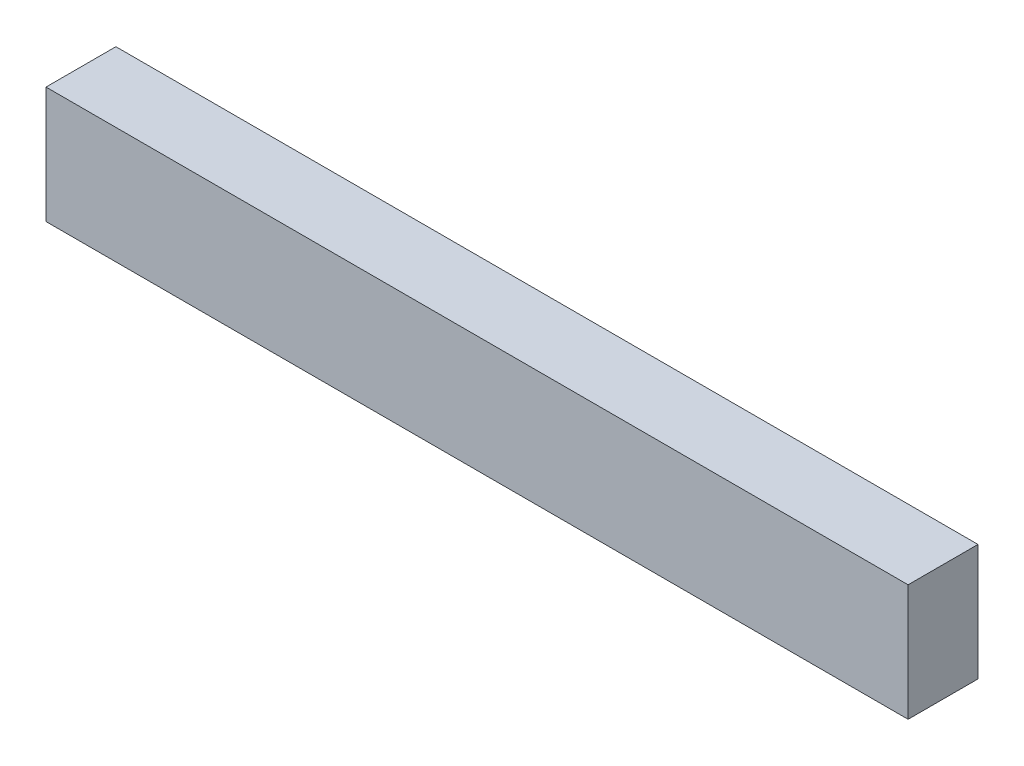
ISO-10303-21;
HEADER;
FILE_DESCRIPTION(('STEP AP214'),'2;1');
FILE_NAME('part.step','',(''),(''),'','','');
FILE_SCHEMA(('AUTOMOTIVE_DESIGN { 1 0 10303 214 1 1 1 1 }'));
ENDSEC;
DATA;
#1=APPLICATION_CONTEXT('core data for automotive mechanical design processes');
#2=APPLICATION_PROTOCOL_DEFINITION('international standard','automotive_design',2000,#1);
#3=PRODUCT_CONTEXT('',#1,'mechanical');
#4=PRODUCT('Part','Part','',(#3));
#5=PRODUCT_RELATED_PRODUCT_CATEGORY('part','',(#4));
#6=PRODUCT_DEFINITION_FORMATION('','',#4);
#7=PRODUCT_DEFINITION_CONTEXT('part definition',#1,'design');
#8=PRODUCT_DEFINITION('design','',#6,#7);
#9=PRODUCT_DEFINITION_SHAPE('','',#8);
#10=(LENGTH_UNIT() NAMED_UNIT(*) SI_UNIT(.MILLI.,.METRE.));
#11=(NAMED_UNIT(*) PLANE_ANGLE_UNIT() SI_UNIT($,.RADIAN.));
#12=(NAMED_UNIT(*) SI_UNIT($,.STERADIAN.) SOLID_ANGLE_UNIT());
#13=UNCERTAINTY_MEASURE_WITH_UNIT(LENGTH_MEASURE(1.E-05),#10,'distance_accuracy_value','');
#14=(GEOMETRIC_REPRESENTATION_CONTEXT(3) GLOBAL_UNCERTAINTY_ASSIGNED_CONTEXT((#13)) GLOBAL_UNIT_ASSIGNED_CONTEXT((#10,
#11,#12)) REPRESENTATION_CONTEXT('',''));
#15=CARTESIAN_POINT('',(0.,0.,0.));
#16=DIRECTION('',(0.,0.,1.));
#17=DIRECTION('',(1.,0.,0.));
#18=AXIS2_PLACEMENT_3D('',#15,#16,#17);
#19=CARTESIAN_POINT('',(117.475,31.75,9.525));
#20=DIRECTION('',(-1.,0.,0.));
#21=DIRECTION('',(0.,0.,1.));
#22=AXIS2_PLACEMENT_3D('',#19,#20,#21);
#23=PLANE('',#22);
#24=DIRECTION('',(0.,0.,-1.));
#25=VECTOR('',#24,1.);
#26=CARTESIAN_POINT('',(117.475,0.,9.525));
#27=LINE('',#26,#25);
#28=CARTESIAN_POINT('',(117.475,0.,9.525));
#29=VERTEX_POINT('',#28);
#30=CARTESIAN_POINT('',(117.475,0.,-9.525));
#31=VERTEX_POINT('',#30);
#32=EDGE_CURVE('E96',#29,#31,#27,.T.);
#33=ORIENTED_EDGE('',*,*,#32,.T.);
#34=DIRECTION('',(0.,-1.,0.));
#35=VECTOR('',#34,1.);
#36=CARTESIAN_POINT('',(117.475,31.75,-9.525));
#37=LINE('',#36,#35);
#38=CARTESIAN_POINT('',(117.475,31.75,-9.525));
#39=VERTEX_POINT('',#38);
#40=EDGE_CURVE('E11',#39,#31,#37,.T.);
#41=ORIENTED_EDGE('',*,*,#40,.F.);
#42=DIRECTION('',(0.,0.,-1.));
#43=VECTOR('',#42,1.);
#44=CARTESIAN_POINT('',(117.475,31.75,9.525));
#45=LINE('',#44,#43);
#46=CARTESIAN_POINT('',(117.475,31.75,9.525));
#47=VERTEX_POINT('',#46);
#48=EDGE_CURVE('E84',#47,#39,#45,.T.);
#49=ORIENTED_EDGE('',*,*,#48,.F.);
#50=DIRECTION('',(0.,-1.,0.));
#51=VECTOR('',#50,1.);
#52=CARTESIAN_POINT('',(117.475,31.75,9.525));
#53=LINE('',#52,#51);
#54=EDGE_CURVE('E92',#47,#29,#53,.T.);
#55=ORIENTED_EDGE('',*,*,#54,.T.);
#56=EDGE_LOOP('',(#33,#41,#49,#55));
#57=FACE_BOUND('',#56,.T.);
#58=ADVANCED_FACE('F33',(#57),#23,.F.);
#59=CARTESIAN_POINT('',(-117.475,31.75,-9.525));
#60=DIRECTION('',(0.,0.,1.));
#61=DIRECTION('',(1.,0.,0.));
#62=AXIS2_PLACEMENT_3D('',#59,#60,#61);
#63=PLANE('',#62);
#64=DIRECTION('',(-1.,0.,0.));
#65=VECTOR('',#64,1.);
#66=CARTESIAN_POINT('',(-117.475,0.,-9.525));
#67=LINE('',#66,#65);
#68=CARTESIAN_POINT('',(-117.475,0.,-9.525));
#69=VERTEX_POINT('',#68);
#70=EDGE_CURVE('E88',#31,#69,#67,.T.);
#71=ORIENTED_EDGE('',*,*,#70,.T.);
#72=DIRECTION('',(0.,-1.,0.));
#73=VECTOR('',#72,1.);
#74=CARTESIAN_POINT('',(-117.475,31.75,-9.525));
#75=LINE('',#74,#73);
#76=CARTESIAN_POINT('',(-117.475,31.75,-9.525));
#77=VERTEX_POINT('',#76);
#78=EDGE_CURVE('E41',#77,#69,#75,.T.);
#79=ORIENTED_EDGE('',*,*,#78,.F.);
#80=DIRECTION('',(-1.,0.,0.));
#81=VECTOR('',#80,1.);
#82=CARTESIAN_POINT('',(-117.475,31.75,-9.525));
#83=LINE('',#82,#81);
#84=EDGE_CURVE('E79',#39,#77,#83,.T.);
#85=ORIENTED_EDGE('',*,*,#84,.F.);
#86=ORIENTED_EDGE('',*,*,#40,.T.);
#87=EDGE_LOOP('',(#71,#79,#85,#86));
#88=FACE_BOUND('',#87,.T.);
#89=ADVANCED_FACE('F87',(#88),#63,.F.);
#90=CARTESIAN_POINT('',(-117.475,31.75,9.525));
#91=DIRECTION('',(1.,0.,0.));
#92=DIRECTION('',(0.,0.,-1.));
#93=AXIS2_PLACEMENT_3D('',#90,#91,#92);
#94=PLANE('',#93);
#95=DIRECTION('',(0.,0.,1.));
#96=VECTOR('',#95,1.);
#97=CARTESIAN_POINT('',(-117.475,0.,9.525));
#98=LINE('',#97,#96);
#99=CARTESIAN_POINT('',(-117.475,0.,9.525));
#100=VERTEX_POINT('',#99);
#101=EDGE_CURVE('E66',#69,#100,#98,.T.);
#102=ORIENTED_EDGE('',*,*,#101,.T.);
#103=DIRECTION('',(0.,-1.,0.));
#104=VECTOR('',#103,1.);
#105=CARTESIAN_POINT('',(-117.475,31.75,9.525));
#106=LINE('',#105,#104);
#107=CARTESIAN_POINT('',(-117.475,31.75,9.525));
#108=VERTEX_POINT('',#107);
#109=EDGE_CURVE('E89',#108,#100,#106,.T.);
#110=ORIENTED_EDGE('',*,*,#109,.F.);
#111=DIRECTION('',(0.,0.,1.));
#112=VECTOR('',#111,1.);
#113=CARTESIAN_POINT('',(-117.475,31.75,9.525));
#114=LINE('',#113,#112);
#115=EDGE_CURVE('E82',#77,#108,#114,.T.);
#116=ORIENTED_EDGE('',*,*,#115,.F.);
#117=ORIENTED_EDGE('',*,*,#78,.T.);
#118=EDGE_LOOP('',(#102,#110,#116,#117));
#119=FACE_BOUND('',#118,.T.);
#120=ADVANCED_FACE('F90',(#119),#94,.F.);
#121=CARTESIAN_POINT('',(-117.475,31.75,9.525));
#122=DIRECTION('',(0.,0.,-1.));
#123=DIRECTION('',(-1.,0.,0.));
#124=AXIS2_PLACEMENT_3D('',#121,#122,#123);
#125=PLANE('',#124);
#126=DIRECTION('',(1.,0.,0.));
#127=VECTOR('',#126,1.);
#128=CARTESIAN_POINT('',(-117.475,0.,9.525));
#129=LINE('',#128,#127);
#130=EDGE_CURVE('E72',#100,#29,#129,.T.);
#131=ORIENTED_EDGE('',*,*,#130,.T.);
#132=ORIENTED_EDGE('',*,*,#54,.F.);
#133=DIRECTION('',(1.,0.,0.));
#134=VECTOR('',#133,1.);
#135=CARTESIAN_POINT('',(-117.475,31.75,9.525));
#136=LINE('',#135,#134);
#137=EDGE_CURVE('E49',#108,#47,#136,.T.);
#138=ORIENTED_EDGE('',*,*,#137,.F.);
#139=ORIENTED_EDGE('',*,*,#109,.T.);
#140=EDGE_LOOP('',(#131,#132,#138,#139));
#141=FACE_BOUND('',#140,.T.);
#142=ADVANCED_FACE('F103',(#141),#125,.F.);
#143=CARTESIAN_POINT('',(0.,31.75,0.));
#144=DIRECTION('',(0.,-1.,0.));
#145=DIRECTION('',(0.,0.,-1.));
#146=AXIS2_PLACEMENT_3D('',#143,#144,#145);
#147=PLANE('',#146);
#148=ORIENTED_EDGE('',*,*,#48,.T.);
#149=ORIENTED_EDGE('',*,*,#84,.T.);
#150=ORIENTED_EDGE('',*,*,#115,.T.);
#151=ORIENTED_EDGE('',*,*,#137,.T.);
#152=EDGE_LOOP('',(#148,#149,#150,#151));
#153=FACE_BOUND('',#152,.T.);
#154=ADVANCED_FACE('F80',(#153),#147,.F.);
#155=CARTESIAN_POINT('',(0.,0.,0.));
#156=DIRECTION('',(0.,-1.,0.));
#157=DIRECTION('',(0.,0.,-1.));
#158=AXIS2_PLACEMENT_3D('',#155,#156,#157);
#159=PLANE('',#158);
#160=ORIENTED_EDGE('',*,*,#32,.F.);
#161=ORIENTED_EDGE('',*,*,#130,.F.);
#162=ORIENTED_EDGE('',*,*,#101,.F.);
#163=ORIENTED_EDGE('',*,*,#70,.F.);
#164=EDGE_LOOP('',(#160,#161,#162,#163));
#165=FACE_BOUND('',#164,.T.);
#166=ADVANCED_FACE('F106',(#165),#159,.T.);
#167=CLOSED_SHELL('',(#58,#89,#120,#142,#154,#166));
#168=MANIFOLD_SOLID_BREP('B2',#167);
#169=ADVANCED_BREP_SHAPE_REPRESENTATION('',(#18,#168),#14);
#170=SHAPE_DEFINITION_REPRESENTATION(#9,#169);
ENDSEC;
END-ISO-10303-21;
